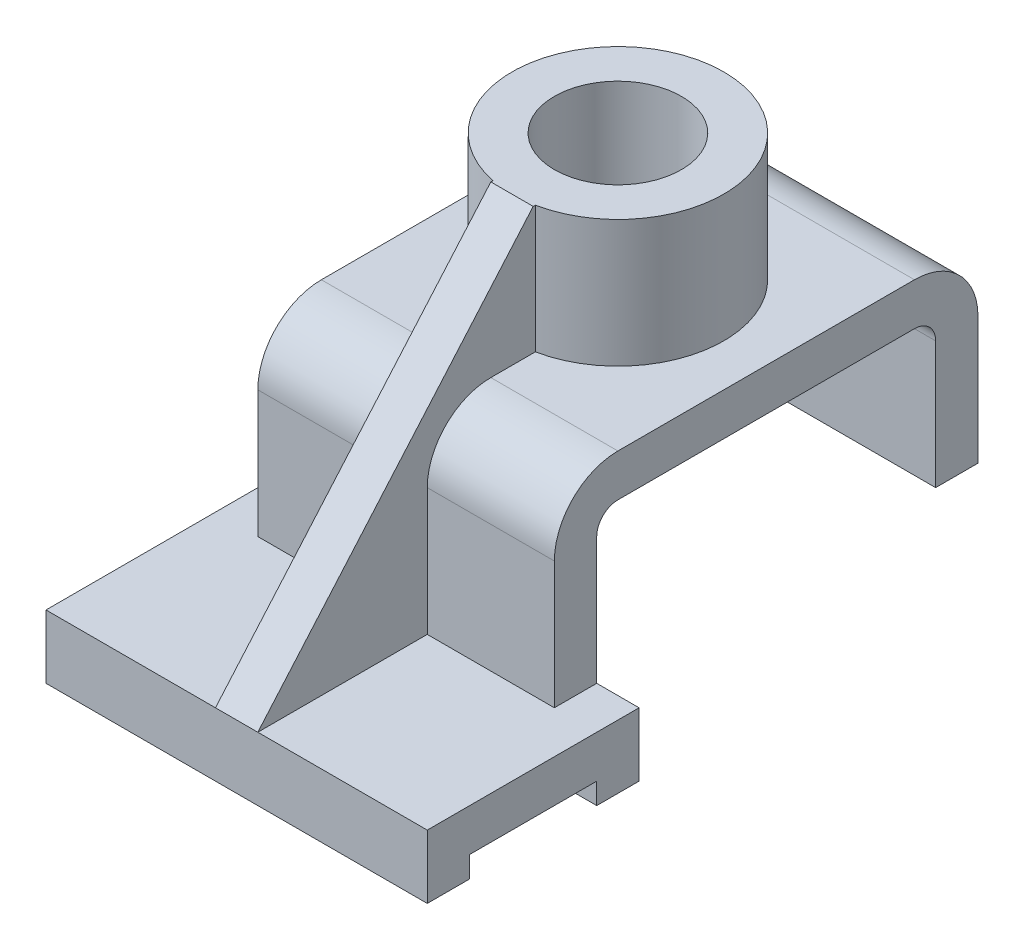
ISO-10303-21;
HEADER;
FILE_DESCRIPTION(('STEP AP214'),'2;1');
FILE_NAME('part.step','',(''),(''),'','','');
FILE_SCHEMA(('AUTOMOTIVE_DESIGN { 1 0 10303 214 1 1 1 1 }'));
ENDSEC;
DATA;
#1=APPLICATION_CONTEXT('core data for automotive mechanical design processes');
#2=APPLICATION_PROTOCOL_DEFINITION('international standard','automotive_design',2000,#1);
#3=PRODUCT_CONTEXT('',#1,'mechanical');
#4=PRODUCT('Part','Part','',(#3));
#5=PRODUCT_RELATED_PRODUCT_CATEGORY('part','',(#4));
#6=PRODUCT_DEFINITION_FORMATION('','',#4);
#7=PRODUCT_DEFINITION_CONTEXT('part definition',#1,'design');
#8=PRODUCT_DEFINITION('design','',#6,#7);
#9=PRODUCT_DEFINITION_SHAPE('','',#8);
#10=(LENGTH_UNIT() NAMED_UNIT(*) SI_UNIT(.MILLI.,.METRE.));
#11=(NAMED_UNIT(*) PLANE_ANGLE_UNIT() SI_UNIT($,.RADIAN.));
#12=(NAMED_UNIT(*) SI_UNIT($,.STERADIAN.) SOLID_ANGLE_UNIT());
#13=UNCERTAINTY_MEASURE_WITH_UNIT(LENGTH_MEASURE(1.E-05),#10,'distance_accuracy_value','');
#14=(GEOMETRIC_REPRESENTATION_CONTEXT(3) GLOBAL_UNCERTAINTY_ASSIGNED_CONTEXT((#13)) GLOBAL_UNIT_ASSIGNED_CONTEXT((#10,
#11,#12)) REPRESENTATION_CONTEXT('',''));
#15=CARTESIAN_POINT('',(0.,0.,0.));
#16=DIRECTION('',(0.,0.,1.));
#17=DIRECTION('',(1.,0.,0.));
#18=AXIS2_PLACEMENT_3D('',#15,#16,#17);
#19=CARTESIAN_POINT('',(-45.,8.35714285714285,30.6428571428572));
#20=DIRECTION('',(0.,1.,0.));
#21=DIRECTION('',(0.,0.,1.));
#22=AXIS2_PLACEMENT_3D('',#19,#20,#21);
#23=PLANE('',#22);
#24=DIRECTION('',(1.,0.,0.));
#25=VECTOR('',#24,1.);
#26=CARTESIAN_POINT('',(-45.,8.35714285714285,30.6428571428572));
#27=LINE('',#26,#25);
#28=CARTESIAN_POINT('',(-45.,8.35714285714285,30.6428571428572));
#29=VERTEX_POINT('',#28);
#30=CARTESIAN_POINT('',(-5.00000000000001,8.35714285714285,30.6428571428572));
#31=VERTEX_POINT('',#30);
#32=EDGE_CURVE('E423',#29,#31,#27,.T.);
#33=ORIENTED_EDGE('',*,*,#32,.T.);
#34=DIRECTION('',(0.,0.,-1.));
#35=VECTOR('',#34,1.);
#36=CARTESIAN_POINT('',(-5.,8.35714285714285,30.6428571428572));
#37=LINE('',#36,#35);
#38=CARTESIAN_POINT('',(-5.,8.35714285714285,-9.35714285714283));
#39=VERTEX_POINT('',#38);
#40=EDGE_CURVE('E253',#31,#39,#37,.T.);
#41=ORIENTED_EDGE('',*,*,#40,.T.);
#42=DIRECTION('',(1.,0.,0.));
#43=VECTOR('',#42,1.);
#44=CARTESIAN_POINT('',(-35.,8.35714285714285,-9.35714285714283));
#45=LINE('',#44,#43);
#46=CARTESIAN_POINT('',(-35.,8.35714285714285,-9.35714285714283));
#47=VERTEX_POINT('',#46);
#48=EDGE_CURVE('E344',#47,#39,#45,.T.);
#49=ORIENTED_EDGE('',*,*,#48,.F.);
#50=DIRECTION('',(0.,0.,-1.));
#51=VECTOR('',#50,1.);
#52=CARTESIAN_POINT('',(-35.,8.35714285714285,-9.35714285714283));
#53=LINE('',#52,#51);
#54=CARTESIAN_POINT('',(-35.,8.35714285714285,-19.3571428571428));
#55=VERTEX_POINT('',#54);
#56=EDGE_CURVE('E273',#47,#55,#53,.T.);
#57=ORIENTED_EDGE('',*,*,#56,.T.);
#58=DIRECTION('',(1.,0.,0.));
#59=VECTOR('',#58,1.);
#60=CARTESIAN_POINT('',(-45.,8.35714285714285,-19.3571428571428));
#61=LINE('',#60,#59);
#62=CARTESIAN_POINT('',(-45.,8.35714285714285,-19.3571428571428));
#63=VERTEX_POINT('',#62);
#64=EDGE_CURVE('E426',#63,#55,#61,.T.);
#65=ORIENTED_EDGE('',*,*,#64,.F.);
#66=DIRECTION('',(0.,0.,1.));
#67=VECTOR('',#66,1.);
#68=CARTESIAN_POINT('',(-45.,8.35714285714285,30.6428571428572));
#69=LINE('',#68,#67);
#70=EDGE_CURVE('E388',#63,#29,#69,.T.);
#71=ORIENTED_EDGE('',*,*,#70,.T.);
#72=EDGE_LOOP('',(#33,#41,#49,#57,#65,#71));
#73=FACE_BOUND('',#72,.T.);
#74=ADVANCED_FACE('F37',(#73),#23,.T.);
#75=CARTESIAN_POINT('',(-35.,38.3571428571429,-9.35714285714282));
#76=DIRECTION('',(0.,0.,1.));
#77=DIRECTION('',(0.,-1.,0.));
#78=AXIS2_PLACEMENT_3D('',#75,#76,#77);
#79=PLANE('',#78);
#80=ORIENTED_EDGE('',*,*,#48,.T.);
#81=DIRECTION('',(0.,1.,0.));
#82=VECTOR('',#81,1.);
#83=CARTESIAN_POINT('',(-5.,38.3571428571429,-9.35714285714282));
#84=LINE('',#83,#82);
#85=CARTESIAN_POINT('',(-5.,38.3571428571429,-9.35714285714282));
#86=VERTEX_POINT('',#85);
#87=EDGE_CURVE('E251',#39,#86,#84,.T.);
#88=ORIENTED_EDGE('',*,*,#87,.T.);
#89=DIRECTION('',(1.,0.,0.));
#90=VECTOR('',#89,1.);
#91=CARTESIAN_POINT('',(-35.,38.3571428571429,-9.35714285714282));
#92=LINE('',#91,#90);
#93=CARTESIAN_POINT('',(-35.,38.3571428571429,-9.35714285714282));
#94=VERTEX_POINT('',#93);
#95=EDGE_CURVE('E349',#94,#86,#92,.T.);
#96=ORIENTED_EDGE('',*,*,#95,.F.);
#97=DIRECTION('',(0.,-1.,0.));
#98=VECTOR('',#97,1.);
#99=CARTESIAN_POINT('',(-35.,38.3571428571429,-9.35714285714282));
#100=LINE('',#99,#98);
#101=EDGE_CURVE('E307',#94,#47,#100,.T.);
#102=ORIENTED_EDGE('',*,*,#101,.T.);
#103=EDGE_LOOP('',(#80,#88,#96,#102));
#104=FACE_BOUND('',#103,.T.);
#105=ADVANCED_FACE('F509',(#104),#79,.T.);
#106=CARTESIAN_POINT('',(-35.,38.3571428571429,-24.3571428571428));
#107=DIRECTION('',(1.,0.,0.));
#108=DIRECTION('',(0.,0.,-1.));
#109=AXIS2_PLACEMENT_3D('',#106,#107,#108);
#110=CYLINDRICAL_SURFACE('',#109,15.);
#111=ORIENTED_EDGE('',*,*,#95,.T.);
#112=CARTESIAN_POINT('',(-5.,38.3571428571429,-24.3571428571428));
#113=DIRECTION('',(1.,0.,0.));
#114=DIRECTION('',(0.,0.,-1.));
#115=AXIS2_PLACEMENT_3D('',#112,#113,#114);
#116=CIRCLE('',#115,15.);
#117=CARTESIAN_POINT('',(-5.,53.3571428571429,-24.3571428571428));
#118=VERTEX_POINT('',#117);
#119=EDGE_CURVE('E247',#86,#118,#116,.F.);
#120=ORIENTED_EDGE('',*,*,#119,.T.);
#121=DIRECTION('',(1.,0.,0.));
#122=VECTOR('',#121,1.);
#123=CARTESIAN_POINT('',(-35.,53.3571428571429,-24.3571428571428));
#124=LINE('',#123,#122);
#125=CARTESIAN_POINT('',(-35.,53.3571428571429,-24.3571428571428));
#126=VERTEX_POINT('',#125);
#127=EDGE_CURVE('E353',#126,#118,#124,.T.);
#128=ORIENTED_EDGE('',*,*,#127,.F.);
#129=CARTESIAN_POINT('',(-35.,38.3571428571429,-24.3571428571428));
#130=DIRECTION('',(1.,0.,0.));
#131=DIRECTION('',(0.,0.,-1.));
#132=AXIS2_PLACEMENT_3D('',#129,#130,#131);
#133=CIRCLE('',#132,15.);
#134=EDGE_CURVE('E304',#126,#94,#133,.T.);
#135=ORIENTED_EDGE('',*,*,#134,.T.);
#136=EDGE_LOOP('',(#111,#120,#128,#135));
#137=FACE_BOUND('',#136,.T.);
#138=ADVANCED_FACE('F513',(#137),#110,.T.);
#139=DIRECTION('',(0.,0.,-1.));
#140=VECTOR('',#139,1.);
#141=CARTESIAN_POINT('',(5.,8.35714285714285,30.6428571428572));
#142=LINE('',#141,#140);
#143=CARTESIAN_POINT('',(4.99999999999998,8.35714285714285,30.6428571428572));
#144=VERTEX_POINT('',#143);
#145=CARTESIAN_POINT('',(5.,8.35714285714285,-9.35714285714283));
#146=VERTEX_POINT('',#145);
#147=EDGE_CURVE('E52',#144,#146,#142,.T.);
#148=ORIENTED_EDGE('',*,*,#147,.F.);
#149=CARTESIAN_POINT('',(45.,8.35714285714285,30.6428571428572));
#150=VERTEX_POINT('',#149);
#151=EDGE_CURVE('E425',#144,#150,#27,.T.);
#152=ORIENTED_EDGE('',*,*,#151,.T.);
#153=DIRECTION('',(0.,0.,1.));
#154=VECTOR('',#153,1.);
#155=CARTESIAN_POINT('',(45.,8.35714285714285,30.6428571428572));
#156=LINE('',#155,#154);
#157=CARTESIAN_POINT('',(45.,8.35714285714285,-19.3571428571428));
#158=VERTEX_POINT('',#157);
#159=EDGE_CURVE('E412',#158,#150,#156,.T.);
#160=ORIENTED_EDGE('',*,*,#159,.F.);
#161=CARTESIAN_POINT('',(35.,8.35714285714285,-19.3571428571428));
#162=VERTEX_POINT('',#161);
#163=EDGE_CURVE('E429',#162,#158,#61,.T.);
#164=ORIENTED_EDGE('',*,*,#163,.F.);
#165=DIRECTION('',(0.,0.,-1.));
#166=VECTOR('',#165,1.);
#167=CARTESIAN_POINT('',(35.,8.35714285714285,-9.35714285714283));
#168=LINE('',#167,#166);
#169=CARTESIAN_POINT('',(35.,8.35714285714285,-9.35714285714283));
#170=VERTEX_POINT('',#169);
#171=EDGE_CURVE('E271',#170,#162,#168,.T.);
#172=ORIENTED_EDGE('',*,*,#171,.F.);
#173=EDGE_CURVE('E348',#146,#170,#45,.T.);
#174=ORIENTED_EDGE('',*,*,#173,.F.);
#175=EDGE_LOOP('',(#148,#152,#160,#164,#172,#174));
#176=FACE_BOUND('',#175,.T.);
#177=ADVANCED_FACE('F468',(#176),#23,.T.);
#178=CARTESIAN_POINT('',(-45.,-1.64285714285714,20.6428571428572));
#179=DIRECTION('',(0.,0.,-1.));
#180=DIRECTION('',(0.,1.,0.));
#181=AXIS2_PLACEMENT_3D('',#178,#179,#180);
#182=PLANE('',#181);
#183=DIRECTION('',(0.,1.,0.));
#184=VECTOR('',#183,1.);
#185=CARTESIAN_POINT('',(45.,-1.64285714285714,20.6428571428572));
#186=LINE('',#185,#184);
#187=CARTESIAN_POINT('',(45.,-6.64285714285714,20.6428571428572));
#188=VERTEX_POINT('',#187);
#189=CARTESIAN_POINT('',(45.,-1.64285714285714,20.6428571428572));
#190=VERTEX_POINT('',#189);
#191=EDGE_CURVE('E347',#188,#190,#186,.T.);
#192=ORIENTED_EDGE('',*,*,#191,.F.);
#193=DIRECTION('',(1.,0.,0.));
#194=VECTOR('',#193,1.);
#195=CARTESIAN_POINT('',(-45.,-6.64285714285714,20.6428571428572));
#196=LINE('',#195,#194);
#197=CARTESIAN_POINT('',(-45.,-6.64285714285714,20.6428571428572));
#198=VERTEX_POINT('',#197);
#199=EDGE_CURVE('E45',#198,#188,#196,.T.);
#200=ORIENTED_EDGE('',*,*,#199,.F.);
#201=DIRECTION('',(0.,1.,0.));
#202=VECTOR('',#201,1.);
#203=CARTESIAN_POINT('',(-45.,-1.64285714285714,20.6428571428572));
#204=LINE('',#203,#202);
#205=CARTESIAN_POINT('',(-45.,-1.64285714285714,20.6428571428572));
#206=VERTEX_POINT('',#205);
#207=EDGE_CURVE('E372',#198,#206,#204,.T.);
#208=ORIENTED_EDGE('',*,*,#207,.T.);
#209=DIRECTION('',(1.,0.,0.));
#210=VECTOR('',#209,1.);
#211=CARTESIAN_POINT('',(-45.,-1.64285714285714,20.6428571428572));
#212=LINE('',#211,#210);
#213=EDGE_CURVE('E397',#206,#190,#212,.T.);
#214=ORIENTED_EDGE('',*,*,#213,.T.);
#215=EDGE_LOOP('',(#192,#200,#208,#214));
#216=FACE_BOUND('',#215,.T.);
#217=ADVANCED_FACE('F39',(#216),#182,.T.);
#218=CARTESIAN_POINT('',(-45.,-6.64285714285714,20.6428571428572));
#219=DIRECTION('',(0.,-1.,0.));
#220=DIRECTION('',(0.,0.,-1.));
#221=AXIS2_PLACEMENT_3D('',#218,#219,#220);
#222=PLANE('',#221);
#223=DIRECTION('',(0.,0.,-1.));
#224=VECTOR('',#223,1.);
#225=CARTESIAN_POINT('',(45.,-6.64285714285714,20.6428571428572));
#226=LINE('',#225,#224);
#227=CARTESIAN_POINT('',(45.,-6.64285714285714,30.6428571428572));
#228=VERTEX_POINT('',#227);
#229=EDGE_CURVE('E376',#228,#188,#226,.T.);
#230=ORIENTED_EDGE('',*,*,#229,.F.);
#231=DIRECTION('',(1.,0.,0.));
#232=VECTOR('',#231,1.);
#233=CARTESIAN_POINT('',(-45.,-6.64285714285714,30.6428571428572));
#234=LINE('',#233,#232);
#235=CARTESIAN_POINT('',(-45.,-6.64285714285714,30.6428571428572));
#236=VERTEX_POINT('',#235);
#237=EDGE_CURVE('E421',#236,#228,#234,.T.);
#238=ORIENTED_EDGE('',*,*,#237,.F.);
#239=DIRECTION('',(0.,0.,-1.));
#240=VECTOR('',#239,1.);
#241=CARTESIAN_POINT('',(-45.,-6.64285714285714,20.6428571428572));
#242=LINE('',#241,#240);
#243=EDGE_CURVE('E394',#236,#198,#242,.T.);
#244=ORIENTED_EDGE('',*,*,#243,.T.);
#245=ORIENTED_EDGE('',*,*,#199,.T.);
#246=EDGE_LOOP('',(#230,#238,#244,#245));
#247=FACE_BOUND('',#246,.T.);
#248=ADVANCED_FACE('F448',(#247),#222,.T.);
#249=CARTESIAN_POINT('',(-45.,-6.64285714285714,30.6428571428572));
#250=DIRECTION('',(0.,0.,1.));
#251=DIRECTION('',(1.,0.,0.));
#252=AXIS2_PLACEMENT_3D('',#249,#250,#251);
#253=PLANE('',#252);
#254=ORIENTED_EDGE('',*,*,#151,.F.);
#255=DIRECTION('',(1.,0.,0.));
#256=VECTOR('',#255,1.);
#257=CARTESIAN_POINT('',(0.,8.35714285714285,30.6428571428572));
#258=LINE('',#257,#256);
#259=EDGE_CURVE('E59',#31,#144,#258,.T.);
#260=ORIENTED_EDGE('',*,*,#259,.F.);
#261=ORIENTED_EDGE('',*,*,#32,.F.);
#262=DIRECTION('',(0.,-1.,0.));
#263=VECTOR('',#262,1.);
#264=CARTESIAN_POINT('',(-45.,-6.64285714285714,30.6428571428572));
#265=LINE('',#264,#263);
#266=EDGE_CURVE('E391',#29,#236,#265,.T.);
#267=ORIENTED_EDGE('',*,*,#266,.T.);
#268=ORIENTED_EDGE('',*,*,#237,.T.);
#269=DIRECTION('',(0.,-1.,0.));
#270=VECTOR('',#269,1.);
#271=CARTESIAN_POINT('',(45.,-6.64285714285714,30.6428571428572));
#272=LINE('',#271,#270);
#273=EDGE_CURVE('E415',#150,#228,#272,.T.);
#274=ORIENTED_EDGE('',*,*,#273,.F.);
#275=EDGE_LOOP('',(#254,#260,#261,#267,#268,#274));
#276=FACE_BOUND('',#275,.T.);
#277=ADVANCED_FACE('F469',(#276),#253,.T.);
#278=CARTESIAN_POINT('',(-45.,8.35714285714285,-19.3571428571428));
#279=DIRECTION('',(0.,0.,-1.));
#280=DIRECTION('',(0.,1.,0.));
#281=AXIS2_PLACEMENT_3D('',#278,#279,#280);
#282=PLANE('',#281);
#283=DIRECTION('',(0.,1.,0.));
#284=VECTOR('',#283,1.);
#285=CARTESIAN_POINT('',(45.,8.35714285714285,-19.3571428571428));
#286=LINE('',#285,#284);
#287=CARTESIAN_POINT('',(45.,-6.64285714285714,-19.3571428571428));
#288=VERTEX_POINT('',#287);
#289=EDGE_CURVE('E409',#288,#158,#286,.T.);
#290=ORIENTED_EDGE('',*,*,#289,.F.);
#291=DIRECTION('',(1.,0.,0.));
#292=VECTOR('',#291,1.);
#293=CARTESIAN_POINT('',(-45.,-6.64285714285714,-19.3571428571428));
#294=LINE('',#293,#292);
#295=CARTESIAN_POINT('',(-45.,-6.64285714285714,-19.3571428571428));
#296=VERTEX_POINT('',#295);
#297=EDGE_CURVE('E430',#296,#288,#294,.T.);
#298=ORIENTED_EDGE('',*,*,#297,.F.);
#299=DIRECTION('',(0.,1.,0.));
#300=VECTOR('',#299,1.);
#301=CARTESIAN_POINT('',(-45.,8.35714285714285,-19.3571428571428));
#302=LINE('',#301,#300);
#303=EDGE_CURVE('E385',#296,#63,#302,.T.);
#304=ORIENTED_EDGE('',*,*,#303,.T.);
#305=ORIENTED_EDGE('',*,*,#64,.T.);
#306=DIRECTION('',(0.,1.,0.));
#307=VECTOR('',#306,1.);
#308=CARTESIAN_POINT('',(-35.,8.35714285714285,-19.3571428571428));
#309=LINE('',#308,#307);
#310=CARTESIAN_POINT('',(-35.,38.3571428571429,-19.3571428571428));
#311=VERTEX_POINT('',#310);
#312=EDGE_CURVE('E276',#55,#311,#309,.T.);
#313=ORIENTED_EDGE('',*,*,#312,.T.);
#314=DIRECTION('',(1.,0.,0.));
#315=VECTOR('',#314,1.);
#316=CARTESIAN_POINT('',(-35.,38.3571428571429,-19.3571428571428));
#317=LINE('',#316,#315);
#318=CARTESIAN_POINT('',(35.,38.3571428571429,-19.3571428571428));
#319=VERTEX_POINT('',#318);
#320=EDGE_CURVE('E310',#311,#319,#317,.T.);
#321=ORIENTED_EDGE('',*,*,#320,.T.);
#322=DIRECTION('',(0.,1.,0.));
#323=VECTOR('',#322,1.);
#324=CARTESIAN_POINT('',(35.,8.35714285714285,-19.3571428571428));
#325=LINE('',#324,#323);
#326=EDGE_CURVE('E312',#162,#319,#325,.T.);
#327=ORIENTED_EDGE('',*,*,#326,.F.);
#328=ORIENTED_EDGE('',*,*,#163,.T.);
#329=EDGE_LOOP('',(#290,#298,#304,#305,#313,#321,#327,#328));
#330=FACE_BOUND('',#329,.T.);
#331=ADVANCED_FACE('F463',(#330),#282,.T.);
#332=CARTESIAN_POINT('',(-45.,-6.64285714285714,-19.3571428571428));
#333=DIRECTION('',(0.,-1.,0.));
#334=DIRECTION('',(0.,0.,-1.));
#335=AXIS2_PLACEMENT_3D('',#332,#333,#334);
#336=PLANE('',#335);
#337=DIRECTION('',(0.,0.,-1.));
#338=VECTOR('',#337,1.);
#339=CARTESIAN_POINT('',(45.,-6.64285714285714,-19.3571428571428));
#340=LINE('',#339,#338);
#341=CARTESIAN_POINT('',(45.,-6.64285714285714,-9.35714285714283));
#342=VERTEX_POINT('',#341);
#343=EDGE_CURVE('E406',#342,#288,#340,.T.);
#344=ORIENTED_EDGE('',*,*,#343,.F.);
#345=DIRECTION('',(1.,0.,0.));
#346=VECTOR('',#345,1.);
#347=CARTESIAN_POINT('',(-45.,-6.64285714285714,-9.35714285714283));
#348=LINE('',#347,#346);
#349=CARTESIAN_POINT('',(-45.,-6.64285714285714,-9.35714285714283));
#350=VERTEX_POINT('',#349);
#351=EDGE_CURVE('E432',#350,#342,#348,.T.);
#352=ORIENTED_EDGE('',*,*,#351,.F.);
#353=DIRECTION('',(0.,0.,-1.));
#354=VECTOR('',#353,1.);
#355=CARTESIAN_POINT('',(-45.,-6.64285714285714,-19.3571428571428));
#356=LINE('',#355,#354);
#357=EDGE_CURVE('E382',#350,#296,#356,.T.);
#358=ORIENTED_EDGE('',*,*,#357,.T.);
#359=ORIENTED_EDGE('',*,*,#297,.T.);
#360=EDGE_LOOP('',(#344,#352,#358,#359));
#361=FACE_BOUND('',#360,.T.);
#362=ADVANCED_FACE('F461',(#361),#336,.T.);
#363=CARTESIAN_POINT('',(-45.,-6.64285714285714,-9.35714285714283));
#364=DIRECTION('',(0.,0.,1.));
#365=DIRECTION('',(0.,-1.,0.));
#366=AXIS2_PLACEMENT_3D('',#363,#364,#365);
#367=PLANE('',#366);
#368=DIRECTION('',(0.,-1.,0.));
#369=VECTOR('',#368,1.);
#370=CARTESIAN_POINT('',(45.,-6.64285714285714,-9.35714285714283));
#371=LINE('',#370,#369);
#372=CARTESIAN_POINT('',(45.,-1.64285714285714,-9.35714285714282));
#373=VERTEX_POINT('',#372);
#374=EDGE_CURVE('E403',#373,#342,#371,.T.);
#375=ORIENTED_EDGE('',*,*,#374,.F.);
#376=DIRECTION('',(1.,0.,0.));
#377=VECTOR('',#376,1.);
#378=CARTESIAN_POINT('',(-45.,-1.64285714285714,-9.35714285714282));
#379=LINE('',#378,#377);
#380=CARTESIAN_POINT('',(-45.,-1.64285714285714,-9.35714285714282));
#381=VERTEX_POINT('',#380);
#382=EDGE_CURVE('E434',#381,#373,#379,.T.);
#383=ORIENTED_EDGE('',*,*,#382,.F.);
#384=DIRECTION('',(0.,-1.,0.));
#385=VECTOR('',#384,1.);
#386=CARTESIAN_POINT('',(-45.,-6.64285714285714,-9.35714285714283));
#387=LINE('',#386,#385);
#388=EDGE_CURVE('E379',#381,#350,#387,.T.);
#389=ORIENTED_EDGE('',*,*,#388,.T.);
#390=ORIENTED_EDGE('',*,*,#351,.T.);
#391=EDGE_LOOP('',(#375,#383,#389,#390));
#392=FACE_BOUND('',#391,.T.);
#393=ADVANCED_FACE('F457',(#392),#367,.T.);
#394=CARTESIAN_POINT('',(-45.,-1.64285714285714,-9.35714285714282));
#395=DIRECTION('',(0.,-1.,0.));
#396=DIRECTION('',(0.,0.,-1.));
#397=AXIS2_PLACEMENT_3D('',#394,#395,#396);
#398=PLANE('',#397);
#399=DIRECTION('',(0.,0.,-1.));
#400=VECTOR('',#399,1.);
#401=CARTESIAN_POINT('',(45.,-1.64285714285714,-9.35714285714282));
#402=LINE('',#401,#400);
#403=EDGE_CURVE('E400',#190,#373,#402,.T.);
#404=ORIENTED_EDGE('',*,*,#403,.F.);
#405=ORIENTED_EDGE('',*,*,#213,.F.);
#406=DIRECTION('',(0.,0.,-1.));
#407=VECTOR('',#406,1.);
#408=CARTESIAN_POINT('',(-45.,-1.64285714285714,-9.35714285714282));
#409=LINE('',#408,#407);
#410=EDGE_CURVE('E375',#206,#381,#409,.T.);
#411=ORIENTED_EDGE('',*,*,#410,.T.);
#412=ORIENTED_EDGE('',*,*,#382,.T.);
#413=EDGE_LOOP('',(#404,#405,#411,#412));
#414=FACE_BOUND('',#413,.T.);
#415=ADVANCED_FACE('F441',(#414),#398,.T.);
#416=CARTESIAN_POINT('',(-45.,0.,0.));
#417=DIRECTION('',(-1.,0.,0.));
#418=DIRECTION('',(0.,0.,1.));
#419=AXIS2_PLACEMENT_3D('',#416,#417,#418);
#420=PLANE('',#419);
#421=ORIENTED_EDGE('',*,*,#207,.F.);
#422=ORIENTED_EDGE('',*,*,#243,.F.);
#423=ORIENTED_EDGE('',*,*,#266,.F.);
#424=ORIENTED_EDGE('',*,*,#70,.F.);
#425=ORIENTED_EDGE('',*,*,#303,.F.);
#426=ORIENTED_EDGE('',*,*,#357,.F.);
#427=ORIENTED_EDGE('',*,*,#388,.F.);
#428=ORIENTED_EDGE('',*,*,#410,.F.);
#429=EDGE_LOOP('',(#421,#422,#423,#424,#425,#426,#427,#428));
#430=FACE_BOUND('',#429,.T.);
#431=ADVANCED_FACE('F451',(#430),#420,.T.);
#432=CARTESIAN_POINT('',(45.,0.,0.));
#433=DIRECTION('',(-1.,0.,0.));
#434=DIRECTION('',(0.,0.,1.));
#435=AXIS2_PLACEMENT_3D('',#432,#433,#434);
#436=PLANE('',#435);
#437=ORIENTED_EDGE('',*,*,#191,.T.);
#438=ORIENTED_EDGE('',*,*,#403,.T.);
#439=ORIENTED_EDGE('',*,*,#374,.T.);
#440=ORIENTED_EDGE('',*,*,#343,.T.);
#441=ORIENTED_EDGE('',*,*,#289,.T.);
#442=ORIENTED_EDGE('',*,*,#159,.T.);
#443=ORIENTED_EDGE('',*,*,#273,.T.);
#444=ORIENTED_EDGE('',*,*,#229,.T.);
#445=EDGE_LOOP('',(#437,#438,#439,#440,#441,#442,#443,#444));
#446=FACE_BOUND('',#445,.T.);
#447=ADVANCED_FACE('F444',(#446),#436,.F.);
#448=DIRECTION('',(0.,1.,0.));
#449=VECTOR('',#448,1.);
#450=CARTESIAN_POINT('',(5.,38.3571428571429,-9.35714285714282));
#451=LINE('',#450,#449);
#452=CARTESIAN_POINT('',(5.,38.3571428571429,-9.35714285714282));
#453=VERTEX_POINT('',#452);
#454=EDGE_CURVE('E261',#146,#453,#451,.T.);
#455=ORIENTED_EDGE('',*,*,#454,.F.);
#456=ORIENTED_EDGE('',*,*,#173,.T.);
#457=DIRECTION('',(0.,-1.,0.));
#458=VECTOR('',#457,1.);
#459=CARTESIAN_POINT('',(35.,38.3571428571429,-9.35714285714282));
#460=LINE('',#459,#458);
#461=CARTESIAN_POINT('',(35.,38.3571428571429,-9.35714285714282));
#462=VERTEX_POINT('',#461);
#463=EDGE_CURVE('E277',#462,#170,#460,.T.);
#464=ORIENTED_EDGE('',*,*,#463,.F.);
#465=EDGE_CURVE('E352',#453,#462,#92,.T.);
#466=ORIENTED_EDGE('',*,*,#465,.F.);
#467=EDGE_LOOP('',(#455,#456,#464,#466));
#468=FACE_BOUND('',#467,.T.);
#469=ADVANCED_FACE('F489',(#468),#79,.T.);
#470=CARTESIAN_POINT('',(5.,38.3571428571429,-24.3571428571428));
#471=DIRECTION('',(1.,0.,0.));
#472=DIRECTION('',(0.,0.,-1.));
#473=AXIS2_PLACEMENT_3D('',#470,#471,#472);
#474=CIRCLE('',#473,15.);
#475=CARTESIAN_POINT('',(5.,53.3571428571429,-24.3571428571428));
#476=VERTEX_POINT('',#475);
#477=EDGE_CURVE('E257',#453,#476,#474,.F.);
#478=ORIENTED_EDGE('',*,*,#477,.F.);
#479=ORIENTED_EDGE('',*,*,#465,.T.);
#480=CARTESIAN_POINT('',(35.,38.3571428571429,-24.3571428571428));
#481=DIRECTION('',(1.,0.,0.));
#482=DIRECTION('',(0.,0.,-1.));
#483=AXIS2_PLACEMENT_3D('',#480,#481,#482);
#484=CIRCLE('',#483,15.);
#485=CARTESIAN_POINT('',(35.,53.3571428571429,-24.3571428571428));
#486=VERTEX_POINT('',#485);
#487=EDGE_CURVE('E339',#486,#462,#484,.T.);
#488=ORIENTED_EDGE('',*,*,#487,.F.);
#489=EDGE_CURVE('E356',#476,#486,#124,.T.);
#490=ORIENTED_EDGE('',*,*,#489,.F.);
#491=EDGE_LOOP('',(#478,#479,#488,#490));
#492=FACE_BOUND('',#491,.T.);
#493=ADVANCED_FACE('F492',(#492),#110,.T.);
#494=CARTESIAN_POINT('',(-35.,53.3571428571429,-94.3571428571428));
#495=DIRECTION('',(0.,1.,0.));
#496=DIRECTION('',(0.,0.,1.));
#497=AXIS2_PLACEMENT_3D('',#494,#495,#496);
#498=PLANE('',#497);
#499=DIRECTION('',(0.,0.,-1.));
#500=VECTOR('',#499,1.);
#501=CARTESIAN_POINT('',(5.,53.3571428571429,-94.3571428571428));
#502=LINE('',#501,#500);
#503=CARTESIAN_POINT('',(5.,53.3571428571429,-34.862245429311));
#504=VERTEX_POINT('',#503);
#505=EDGE_CURVE('E255',#476,#504,#502,.T.);
#506=ORIENTED_EDGE('',*,*,#505,.F.);
#507=ORIENTED_EDGE('',*,*,#489,.T.);
#508=DIRECTION('',(0.,0.,1.));
#509=VECTOR('',#508,1.);
#510=CARTESIAN_POINT('',(35.,53.3571428571429,-94.3571428571428));
#511=LINE('',#510,#509);
#512=CARTESIAN_POINT('',(35.,53.3571428571429,-94.3571428571428));
#513=VERTEX_POINT('',#512);
#514=EDGE_CURVE('E336',#513,#486,#511,.T.);
#515=ORIENTED_EDGE('',*,*,#514,.F.);
#516=DIRECTION('',(1.,0.,0.));
#517=VECTOR('',#516,1.);
#518=CARTESIAN_POINT('',(-35.,53.3571428571429,-94.3571428571428));
#519=LINE('',#518,#517);
#520=CARTESIAN_POINT('',(-35.,53.3571428571429,-94.3571428571428));
#521=VERTEX_POINT('',#520);
#522=EDGE_CURVE('E357',#521,#513,#519,.T.);
#523=ORIENTED_EDGE('',*,*,#522,.F.);
#524=DIRECTION('',(0.,0.,1.));
#525=VECTOR('',#524,1.);
#526=CARTESIAN_POINT('',(-35.,53.3571428571429,-94.3571428571428));
#527=LINE('',#526,#525);
#528=EDGE_CURVE('E301',#521,#126,#527,.T.);
#529=ORIENTED_EDGE('',*,*,#528,.T.);
#530=ORIENTED_EDGE('',*,*,#127,.T.);
#531=DIRECTION('',(0.,0.,-1.));
#532=VECTOR('',#531,1.);
#533=CARTESIAN_POINT('',(-5.,53.3571428571429,-94.3571428571428));
#534=LINE('',#533,#532);
#535=CARTESIAN_POINT('',(-5.,53.3571428571429,-34.862245429311));
#536=VERTEX_POINT('',#535);
#537=EDGE_CURVE('E244',#118,#536,#534,.T.);
#538=ORIENTED_EDGE('',*,*,#537,.T.);
#539=CARTESIAN_POINT('',(0.,53.3571428571429,-59.3571428571428));
#540=DIRECTION('',(0.,1.,0.));
#541=DIRECTION('',(0.,0.,1.));
#542=AXIS2_PLACEMENT_3D('',#539,#540,#541);
#543=CIRCLE('',#542,25.);
#544=EDGE_CURVE('E268',#504,#536,#543,.T.);
#545=ORIENTED_EDGE('',*,*,#544,.F.);
#546=EDGE_LOOP('',(#506,#507,#515,#523,#529,#530,#538,#545));
#547=FACE_BOUND('',#546,.T.);
#548=ADVANCED_FACE('F497',(#547),#498,.T.);
#549=CARTESIAN_POINT('',(-35.,38.3571428571429,-94.3571428571428));
#550=DIRECTION('',(1.,0.,0.));
#551=DIRECTION('',(0.,0.,-1.));
#552=AXIS2_PLACEMENT_3D('',#549,#550,#551);
#553=CYLINDRICAL_SURFACE('',#552,15.);
#554=CARTESIAN_POINT('',(35.,38.3571428571429,-94.3571428571428));
#555=DIRECTION('',(1.,0.,0.));
#556=DIRECTION('',(0.,0.,-1.));
#557=AXIS2_PLACEMENT_3D('',#554,#555,#556);
#558=CIRCLE('',#557,15.);
#559=CARTESIAN_POINT('',(35.,38.3571428571429,-109.357142857143));
#560=VERTEX_POINT('',#559);
#561=EDGE_CURVE('E333',#560,#513,#558,.T.);
#562=ORIENTED_EDGE('',*,*,#561,.F.);
#563=DIRECTION('',(1.,0.,0.));
#564=VECTOR('',#563,1.);
#565=CARTESIAN_POINT('',(-35.,38.3571428571429,-109.357142857143));
#566=LINE('',#565,#564);
#567=CARTESIAN_POINT('',(-35.,38.3571428571429,-109.357142857143));
#568=VERTEX_POINT('',#567);
#569=EDGE_CURVE('E359',#568,#560,#566,.T.);
#570=ORIENTED_EDGE('',*,*,#569,.F.);
#571=CARTESIAN_POINT('',(-35.,38.3571428571429,-94.3571428571428));
#572=DIRECTION('',(1.,0.,0.));
#573=DIRECTION('',(0.,0.,-1.));
#574=AXIS2_PLACEMENT_3D('',#571,#572,#573);
#575=CIRCLE('',#574,15.);
#576=EDGE_CURVE('E298',#568,#521,#575,.T.);
#577=ORIENTED_EDGE('',*,*,#576,.T.);
#578=ORIENTED_EDGE('',*,*,#522,.T.);
#579=EDGE_LOOP('',(#562,#570,#577,#578));
#580=FACE_BOUND('',#579,.T.);
#581=ADVANCED_FACE('F688',(#580),#553,.T.);
#582=CARTESIAN_POINT('',(-35.,8.35714285714285,-109.357142857143));
#583=DIRECTION('',(0.,0.,-1.));
#584=DIRECTION('',(-1.,0.,0.));
#585=AXIS2_PLACEMENT_3D('',#582,#583,#584);
#586=PLANE('',#585);
#587=DIRECTION('',(0.,1.,0.));
#588=VECTOR('',#587,1.);
#589=CARTESIAN_POINT('',(35.,8.35714285714285,-109.357142857143));
#590=LINE('',#589,#588);
#591=CARTESIAN_POINT('',(35.,8.35714285714285,-109.357142857143));
#592=VERTEX_POINT('',#591);
#593=EDGE_CURVE('E330',#592,#560,#590,.T.);
#594=ORIENTED_EDGE('',*,*,#593,.F.);
#595=DIRECTION('',(1.,0.,0.));
#596=VECTOR('',#595,1.);
#597=CARTESIAN_POINT('',(-35.,8.35714285714285,-109.357142857143));
#598=LINE('',#597,#596);
#599=CARTESIAN_POINT('',(-35.,8.35714285714285,-109.357142857143));
#600=VERTEX_POINT('',#599);
#601=EDGE_CURVE('E361',#600,#592,#598,.T.);
#602=ORIENTED_EDGE('',*,*,#601,.F.);
#603=DIRECTION('',(0.,1.,0.));
#604=VECTOR('',#603,1.);
#605=CARTESIAN_POINT('',(-35.,8.35714285714285,-109.357142857143));
#606=LINE('',#605,#604);
#607=EDGE_CURVE('E295',#600,#568,#606,.T.);
#608=ORIENTED_EDGE('',*,*,#607,.T.);
#609=ORIENTED_EDGE('',*,*,#569,.T.);
#610=EDGE_LOOP('',(#594,#602,#608,#609));
#611=FACE_BOUND('',#610,.T.);
#612=ADVANCED_FACE('F698',(#611),#586,.T.);
#613=CARTESIAN_POINT('',(-35.,8.35714285714285,-99.3571428571428));
#614=DIRECTION('',(0.,-1.,0.));
#615=DIRECTION('',(0.,0.,-1.));
#616=AXIS2_PLACEMENT_3D('',#613,#614,#615);
#617=PLANE('',#616);
#618=DIRECTION('',(0.,0.,-1.));
#619=VECTOR('',#618,1.);
#620=CARTESIAN_POINT('',(35.,8.35714285714285,-99.3571428571428));
#621=LINE('',#620,#619);
#622=CARTESIAN_POINT('',(35.,8.35714285714285,-99.3571428571428));
#623=VERTEX_POINT('',#622);
#624=EDGE_CURVE('E327',#623,#592,#621,.T.);
#625=ORIENTED_EDGE('',*,*,#624,.F.);
#626=DIRECTION('',(1.,0.,0.));
#627=VECTOR('',#626,1.);
#628=CARTESIAN_POINT('',(-35.,8.35714285714285,-99.3571428571428));
#629=LINE('',#628,#627);
#630=CARTESIAN_POINT('',(-35.,8.35714285714285,-99.3571428571428));
#631=VERTEX_POINT('',#630);
#632=EDGE_CURVE('E363',#631,#623,#629,.T.);
#633=ORIENTED_EDGE('',*,*,#632,.F.);
#634=DIRECTION('',(0.,0.,-1.));
#635=VECTOR('',#634,1.);
#636=CARTESIAN_POINT('',(-35.,8.35714285714285,-99.3571428571428));
#637=LINE('',#636,#635);
#638=EDGE_CURVE('E292',#631,#600,#637,.T.);
#639=ORIENTED_EDGE('',*,*,#638,.T.);
#640=ORIENTED_EDGE('',*,*,#601,.T.);
#641=EDGE_LOOP('',(#625,#633,#639,#640));
#642=FACE_BOUND('',#641,.T.);
#643=ADVANCED_FACE('F709',(#642),#617,.T.);
#644=CARTESIAN_POINT('',(-35.,38.3571428571429,-99.3571428571428));
#645=DIRECTION('',(0.,0.,1.));
#646=DIRECTION('',(0.,-1.,0.));
#647=AXIS2_PLACEMENT_3D('',#644,#645,#646);
#648=PLANE('',#647);
#649=DIRECTION('',(0.,-1.,0.));
#650=VECTOR('',#649,1.);
#651=CARTESIAN_POINT('',(35.,38.3571428571429,-99.3571428571428));
#652=LINE('',#651,#650);
#653=CARTESIAN_POINT('',(35.,38.3571428571429,-99.3571428571428));
#654=VERTEX_POINT('',#653);
#655=EDGE_CURVE('E324',#654,#623,#652,.T.);
#656=ORIENTED_EDGE('',*,*,#655,.F.);
#657=DIRECTION('',(1.,0.,0.));
#658=VECTOR('',#657,1.);
#659=CARTESIAN_POINT('',(-35.,38.3571428571429,-99.3571428571428));
#660=LINE('',#659,#658);
#661=CARTESIAN_POINT('',(-35.,38.3571428571429,-99.3571428571428));
#662=VERTEX_POINT('',#661);
#663=EDGE_CURVE('E365',#662,#654,#660,.T.);
#664=ORIENTED_EDGE('',*,*,#663,.F.);
#665=DIRECTION('',(0.,-1.,0.));
#666=VECTOR('',#665,1.);
#667=CARTESIAN_POINT('',(-35.,38.3571428571429,-99.3571428571428));
#668=LINE('',#667,#666);
#669=EDGE_CURVE('E289',#662,#631,#668,.T.);
#670=ORIENTED_EDGE('',*,*,#669,.T.);
#671=ORIENTED_EDGE('',*,*,#632,.T.);
#672=EDGE_LOOP('',(#656,#664,#670,#671));
#673=FACE_BOUND('',#672,.T.);
#674=ADVANCED_FACE('F720',(#673),#648,.T.);
#675=CARTESIAN_POINT('',(-35.,38.3571428571429,-94.3571428571428));
#676=DIRECTION('',(1.,0.,0.));
#677=DIRECTION('',(0.,0.,-1.));
#678=AXIS2_PLACEMENT_3D('',#675,#676,#677);
#679=CYLINDRICAL_SURFACE('',#678,5.);
#680=CARTESIAN_POINT('',(35.,38.3571428571429,-94.3571428571428));
#681=DIRECTION('',(-1.,0.,0.));
#682=DIRECTION('',(0.,0.,-1.));
#683=AXIS2_PLACEMENT_3D('',#680,#681,#682);
#684=CIRCLE('',#683,5.);
#685=CARTESIAN_POINT('',(35.,43.3571428571429,-94.3571428571428));
#686=VERTEX_POINT('',#685);
#687=EDGE_CURVE('E321',#686,#654,#684,.T.);
#688=ORIENTED_EDGE('',*,*,#687,.F.);
#689=DIRECTION('',(1.,0.,0.));
#690=VECTOR('',#689,1.);
#691=CARTESIAN_POINT('',(-35.,43.3571428571429,-94.3571428571428));
#692=LINE('',#691,#690);
#693=CARTESIAN_POINT('',(-35.,43.3571428571429,-94.3571428571428));
#694=VERTEX_POINT('',#693);
#695=EDGE_CURVE('E367',#694,#686,#692,.T.);
#696=ORIENTED_EDGE('',*,*,#695,.F.);
#697=CARTESIAN_POINT('',(-35.,38.3571428571429,-94.3571428571428));
#698=DIRECTION('',(-1.,0.,0.));
#699=DIRECTION('',(0.,0.,-1.));
#700=AXIS2_PLACEMENT_3D('',#697,#698,#699);
#701=CIRCLE('',#700,5.);
#702=EDGE_CURVE('E286',#694,#662,#701,.T.);
#703=ORIENTED_EDGE('',*,*,#702,.T.);
#704=ORIENTED_EDGE('',*,*,#663,.T.);
#705=EDGE_LOOP('',(#688,#696,#703,#704));
#706=FACE_BOUND('',#705,.T.);
#707=ADVANCED_FACE('F731',(#706),#679,.F.);
#708=CARTESIAN_POINT('',(-35.,43.3571428571429,-24.3571428571428));
#709=DIRECTION('',(0.,-1.,0.));
#710=DIRECTION('',(0.,0.,-1.));
#711=AXIS2_PLACEMENT_3D('',#708,#709,#710);
#712=PLANE('',#711);
#713=DIRECTION('',(0.,0.,-1.));
#714=VECTOR('',#713,1.);
#715=CARTESIAN_POINT('',(35.,43.3571428571429,-24.3571428571428));
#716=LINE('',#715,#714);
#717=CARTESIAN_POINT('',(35.,43.3571428571429,-24.3571428571428));
#718=VERTEX_POINT('',#717);
#719=EDGE_CURVE('E318',#718,#686,#716,.T.);
#720=ORIENTED_EDGE('',*,*,#719,.F.);
#721=DIRECTION('',(1.,0.,0.));
#722=VECTOR('',#721,1.);
#723=CARTESIAN_POINT('',(-35.,43.3571428571429,-24.3571428571428));
#724=LINE('',#723,#722);
#725=CARTESIAN_POINT('',(-35.,43.3571428571429,-24.3571428571428));
#726=VERTEX_POINT('',#725);
#727=EDGE_CURVE('E369',#726,#718,#724,.T.);
#728=ORIENTED_EDGE('',*,*,#727,.F.);
#729=DIRECTION('',(0.,0.,-1.));
#730=VECTOR('',#729,1.);
#731=CARTESIAN_POINT('',(-35.,43.3571428571429,-24.3571428571428));
#732=LINE('',#731,#730);
#733=EDGE_CURVE('E283',#726,#694,#732,.T.);
#734=ORIENTED_EDGE('',*,*,#733,.T.);
#735=ORIENTED_EDGE('',*,*,#695,.T.);
#736=EDGE_LOOP('',(#720,#728,#734,#735));
#737=FACE_BOUND('',#736,.T.);
#738=ADVANCED_FACE('F742',(#737),#712,.T.);
#739=CARTESIAN_POINT('',(-35.,38.3571428571429,-24.3571428571428));
#740=DIRECTION('',(1.,0.,0.));
#741=DIRECTION('',(0.,0.,-1.));
#742=AXIS2_PLACEMENT_3D('',#739,#740,#741);
#743=CYLINDRICAL_SURFACE('',#742,5.);
#744=CARTESIAN_POINT('',(35.,38.3571428571429,-24.3571428571428));
#745=DIRECTION('',(-1.,0.,0.));
#746=DIRECTION('',(0.,0.,-1.));
#747=AXIS2_PLACEMENT_3D('',#744,#745,#746);
#748=CIRCLE('',#747,5.);
#749=EDGE_CURVE('E315',#319,#718,#748,.T.);
#750=ORIENTED_EDGE('',*,*,#749,.F.);
#751=ORIENTED_EDGE('',*,*,#320,.F.);
#752=CARTESIAN_POINT('',(-35.,38.3571428571429,-24.3571428571428));
#753=DIRECTION('',(-1.,0.,0.));
#754=DIRECTION('',(0.,0.,-1.));
#755=AXIS2_PLACEMENT_3D('',#752,#753,#754);
#756=CIRCLE('',#755,5.);
#757=EDGE_CURVE('E280',#311,#726,#756,.T.);
#758=ORIENTED_EDGE('',*,*,#757,.T.);
#759=ORIENTED_EDGE('',*,*,#727,.T.);
#760=EDGE_LOOP('',(#750,#751,#758,#759));
#761=FACE_BOUND('',#760,.T.);
#762=ADVANCED_FACE('F482',(#761),#743,.F.);
#763=CARTESIAN_POINT('',(-35.,38.3571428571429,-24.3571428571428));
#764=DIRECTION('',(1.,0.,0.));
#765=DIRECTION('',(0.,0.,-1.));
#766=AXIS2_PLACEMENT_3D('',#763,#764,#765);
#767=PLANE('',#766);
#768=ORIENTED_EDGE('',*,*,#56,.F.);
#769=ORIENTED_EDGE('',*,*,#101,.F.);
#770=ORIENTED_EDGE('',*,*,#134,.F.);
#771=ORIENTED_EDGE('',*,*,#528,.F.);
#772=ORIENTED_EDGE('',*,*,#576,.F.);
#773=ORIENTED_EDGE('',*,*,#607,.F.);
#774=ORIENTED_EDGE('',*,*,#638,.F.);
#775=ORIENTED_EDGE('',*,*,#669,.F.);
#776=ORIENTED_EDGE('',*,*,#702,.F.);
#777=ORIENTED_EDGE('',*,*,#733,.F.);
#778=ORIENTED_EDGE('',*,*,#757,.F.);
#779=ORIENTED_EDGE('',*,*,#312,.F.);
#780=EDGE_LOOP('',(#768,#769,#770,#771,#772,#773,#774,#775,#776,#777,#778,#779));
#781=FACE_BOUND('',#780,.T.);
#782=ADVANCED_FACE('F477',(#781),#767,.F.);
#783=CARTESIAN_POINT('',(35.,38.3571428571429,-24.3571428571428));
#784=DIRECTION('',(1.,0.,0.));
#785=DIRECTION('',(0.,0.,-1.));
#786=AXIS2_PLACEMENT_3D('',#783,#784,#785);
#787=PLANE('',#786);
#788=ORIENTED_EDGE('',*,*,#171,.T.);
#789=ORIENTED_EDGE('',*,*,#326,.T.);
#790=ORIENTED_EDGE('',*,*,#749,.T.);
#791=ORIENTED_EDGE('',*,*,#719,.T.);
#792=ORIENTED_EDGE('',*,*,#687,.T.);
#793=ORIENTED_EDGE('',*,*,#655,.T.);
#794=ORIENTED_EDGE('',*,*,#624,.T.);
#795=ORIENTED_EDGE('',*,*,#593,.T.);
#796=ORIENTED_EDGE('',*,*,#561,.T.);
#797=ORIENTED_EDGE('',*,*,#514,.T.);
#798=ORIENTED_EDGE('',*,*,#487,.T.);
#799=ORIENTED_EDGE('',*,*,#463,.T.);
#800=EDGE_LOOP('',(#788,#789,#790,#791,#792,#793,#794,#795,#796,#797,#798,#799));
#801=FACE_BOUND('',#800,.T.);
#802=ADVANCED_FACE('F485',(#801),#787,.T.);
#803=CARTESIAN_POINT('',(0.,83.3571428571429,-59.3571428571428));
#804=DIRECTION('',(0.,1.,0.));
#805=DIRECTION('',(0.,0.,1.));
#806=AXIS2_PLACEMENT_3D('',#803,#804,#805);
#807=PLANE('',#806);
#808=CARTESIAN_POINT('',(0.,83.3571428571429,-59.3571428571428));
#809=DIRECTION('',(0.,1.,0.));
#810=DIRECTION('',(0.,0.,1.));
#811=AXIS2_PLACEMENT_3D('',#808,#809,#810);
#812=CIRCLE('',#811,15.);
#813=CARTESIAN_POINT('',(0.,83.3571428571429,-44.3571428571428));
#814=VERTEX_POINT('',#813);
#815=EDGE_CURVE('E265',#814,#814,#812,.T.);
#816=ORIENTED_EDGE('',*,*,#815,.F.);
#817=EDGE_LOOP('',(#816));
#818=FACE_BOUND('',#817,.T.);
#819=DIRECTION('',(0.,0.,-1.));
#820=VECTOR('',#819,1.);
#821=CARTESIAN_POINT('',(5.,83.3571428571429,-39.3571428571428));
#822=LINE('',#821,#820);
#823=CARTESIAN_POINT('',(5.,83.3571428571429,-34.3571428571428));
#824=VERTEX_POINT('',#823);
#825=CARTESIAN_POINT('',(5.,83.3571428571429,-34.862245429311));
#826=VERTEX_POINT('',#825);
#827=EDGE_CURVE('E220',#824,#826,#822,.T.);
#828=ORIENTED_EDGE('',*,*,#827,.T.);
#829=CARTESIAN_POINT('',(0.,83.3571428571429,-59.3571428571428));
#830=DIRECTION('',(0.,1.,0.));
#831=DIRECTION('',(0.,0.,1.));
#832=AXIS2_PLACEMENT_3D('',#829,#830,#831);
#833=CIRCLE('',#832,25.);
#834=CARTESIAN_POINT('',(-5.,83.3571428571429,-34.862245429311));
#835=VERTEX_POINT('',#834);
#836=EDGE_CURVE('E269',#826,#835,#833,.T.);
#837=ORIENTED_EDGE('',*,*,#836,.T.);
#838=DIRECTION('',(0.,0.,-1.));
#839=VECTOR('',#838,1.);
#840=CARTESIAN_POINT('',(-5.,83.3571428571429,-39.3571428571428));
#841=LINE('',#840,#839);
#842=CARTESIAN_POINT('',(-5.,83.3571428571429,-34.3571428571428));
#843=VERTEX_POINT('',#842);
#844=EDGE_CURVE('E222',#843,#835,#841,.T.);
#845=ORIENTED_EDGE('',*,*,#844,.F.);
#846=DIRECTION('',(1.,0.,0.));
#847=VECTOR('',#846,1.);
#848=CARTESIAN_POINT('',(0.,83.3571428571429,-34.3571428571428));
#849=LINE('',#848,#847);
#850=EDGE_CURVE('E217',#843,#824,#849,.T.);
#851=ORIENTED_EDGE('',*,*,#850,.T.);
#852=EDGE_LOOP('',(#828,#837,#845,#851));
#853=FACE_BOUND('',#852,.T.);
#854=ADVANCED_FACE('F219',(#818,#853),#807,.T.);
#855=CARTESIAN_POINT('',(0.,83.3571428571429,-59.3571428571428));
#856=DIRECTION('',(0.,-1.,0.));
#857=DIRECTION('',(0.,0.,-1.));
#858=AXIS2_PLACEMENT_3D('',#855,#856,#857);
#859=CYLINDRICAL_SURFACE('',#858,25.);
#860=ORIENTED_EDGE('',*,*,#836,.F.);
#861=DIRECTION('',(0.,-1.,0.));
#862=VECTOR('',#861,1.);
#863=CARTESIAN_POINT('',(5.,83.3571428571429,-34.862245429311));
#864=LINE('',#863,#862);
#865=EDGE_CURVE('E235',#826,#504,#864,.T.);
#866=ORIENTED_EDGE('',*,*,#865,.T.);
#867=ORIENTED_EDGE('',*,*,#544,.T.);
#868=DIRECTION('',(0.,-1.,0.));
#869=VECTOR('',#868,1.);
#870=CARTESIAN_POINT('',(-5.,83.3571428571429,-34.862245429311));
#871=LINE('',#870,#869);
#872=EDGE_CURVE('E227',#835,#536,#871,.T.);
#873=ORIENTED_EDGE('',*,*,#872,.F.);
#874=EDGE_LOOP('',(#860,#866,#867,#873));
#875=FACE_BOUND('',#874,.T.);
#876=ADVANCED_FACE('F503',(#875),#859,.T.);
#877=CARTESIAN_POINT('',(0.,83.3571428571429,-59.3571428571428));
#878=DIRECTION('',(0.,-1.,0.));
#879=DIRECTION('',(0.,0.,-1.));
#880=AXIS2_PLACEMENT_3D('',#877,#878,#879);
#881=CYLINDRICAL_SURFACE('',#880,15.);
#882=CARTESIAN_POINT('',(0.,53.3571428571429,-59.3571428571428));
#883=DIRECTION('',(0.,1.,0.));
#884=DIRECTION('',(0.,0.,1.));
#885=AXIS2_PLACEMENT_3D('',#882,#883,#884);
#886=CIRCLE('',#885,15.);
#887=CARTESIAN_POINT('',(0.,53.3571428571429,-44.3571428571428));
#888=VERTEX_POINT('',#887);
#889=EDGE_CURVE('E11',#888,#888,#886,.F.);
#890=ORIENTED_EDGE('',*,*,#889,.T.);
#891=EDGE_LOOP('',(#890));
#892=FACE_BOUND('',#891,.T.);
#893=ORIENTED_EDGE('',*,*,#815,.T.);
#894=EDGE_LOOP('',(#893));
#895=FACE_BOUND('',#894,.T.);
#896=ADVANCED_FACE('F776',(#892,#895),#881,.F.);
#897=ORIENTED_EDGE('',*,*,#889,.F.);
#898=EDGE_LOOP('',(#897));
#899=FACE_BOUND('',#898,.T.);
#900=ADVANCED_FACE('F689',(#899),#498,.T.);
#901=CARTESIAN_POINT('',(5.,38.3571428571429,-39.3571428571428));
#902=DIRECTION('',(1.,0.,0.));
#903=DIRECTION('',(0.,0.,-1.));
#904=AXIS2_PLACEMENT_3D('',#901,#902,#903);
#905=PLANE('',#904);
#906=DIRECTION('',(0.,0.755689082789818,-0.654930538417842));
#907=VECTOR('',#906,1.);
#908=CARTESIAN_POINT('',(5.,8.35714285714285,30.6428571428572));
#909=LINE('',#908,#907);
#910=EDGE_CURVE('E233',#144,#824,#909,.T.);
#911=ORIENTED_EDGE('',*,*,#910,.F.);
#912=ORIENTED_EDGE('',*,*,#147,.T.);
#913=ORIENTED_EDGE('',*,*,#454,.T.);
#914=ORIENTED_EDGE('',*,*,#477,.T.);
#915=ORIENTED_EDGE('',*,*,#505,.T.);
#916=ORIENTED_EDGE('',*,*,#865,.F.);
#917=ORIENTED_EDGE('',*,*,#827,.F.);
#918=EDGE_LOOP('',(#911,#912,#913,#914,#915,#916,#917));
#919=FACE_BOUND('',#918,.T.);
#920=ADVANCED_FACE('F232',(#919),#905,.T.);
#921=CARTESIAN_POINT('',(-5.,38.3571428571429,-39.3571428571428));
#922=DIRECTION('',(1.,0.,0.));
#923=DIRECTION('',(0.,0.,-1.));
#924=AXIS2_PLACEMENT_3D('',#921,#922,#923);
#925=PLANE('',#924);
#926=ORIENTED_EDGE('',*,*,#40,.F.);
#927=DIRECTION('',(0.,0.755689082789818,-0.654930538417842));
#928=VECTOR('',#927,1.);
#929=CARTESIAN_POINT('',(-5.,8.35714285714285,30.6428571428572));
#930=LINE('',#929,#928);
#931=EDGE_CURVE('E236',#31,#843,#930,.T.);
#932=ORIENTED_EDGE('',*,*,#931,.T.);
#933=ORIENTED_EDGE('',*,*,#844,.T.);
#934=ORIENTED_EDGE('',*,*,#872,.T.);
#935=ORIENTED_EDGE('',*,*,#537,.F.);
#936=ORIENTED_EDGE('',*,*,#119,.F.);
#937=ORIENTED_EDGE('',*,*,#87,.F.);
#938=EDGE_LOOP('',(#926,#932,#933,#934,#935,#936,#937));
#939=FACE_BOUND('',#938,.T.);
#940=ADVANCED_FACE('F505',(#939),#925,.F.);
#941=CARTESIAN_POINT('',(0.,8.35714285714285,30.6428571428572));
#942=DIRECTION('',(0.,-0.654930538417842,-0.755689082789818));
#943=DIRECTION('',(0.,0.755689082789818,-0.654930538417842));
#944=AXIS2_PLACEMENT_3D('',#941,#942,#943);
#945=PLANE('',#944);
#946=ORIENTED_EDGE('',*,*,#850,.F.);
#947=ORIENTED_EDGE('',*,*,#931,.F.);
#948=ORIENTED_EDGE('',*,*,#259,.T.);
#949=ORIENTED_EDGE('',*,*,#910,.T.);
#950=EDGE_LOOP('',(#946,#947,#948,#949));
#951=FACE_BOUND('',#950,.T.);
#952=ADVANCED_FACE('F238',(#951),#945,.F.);
#953=CLOSED_SHELL('',(#74,#105,#138,#177,#217,#248,#277,#331,#362,#393,#415,#431,#447,#469,#493,
#548,#581,#612,#643,#674,#707,#738,#762,#782,#802,#854,#876,#896,#900,#920,#940,#952));
#954=MANIFOLD_SOLID_BREP('B2',#953);
#955=ADVANCED_BREP_SHAPE_REPRESENTATION('',(#18,#954),#14);
#956=SHAPE_DEFINITION_REPRESENTATION(#9,#955);
ENDSEC;
END-ISO-10303-21;
